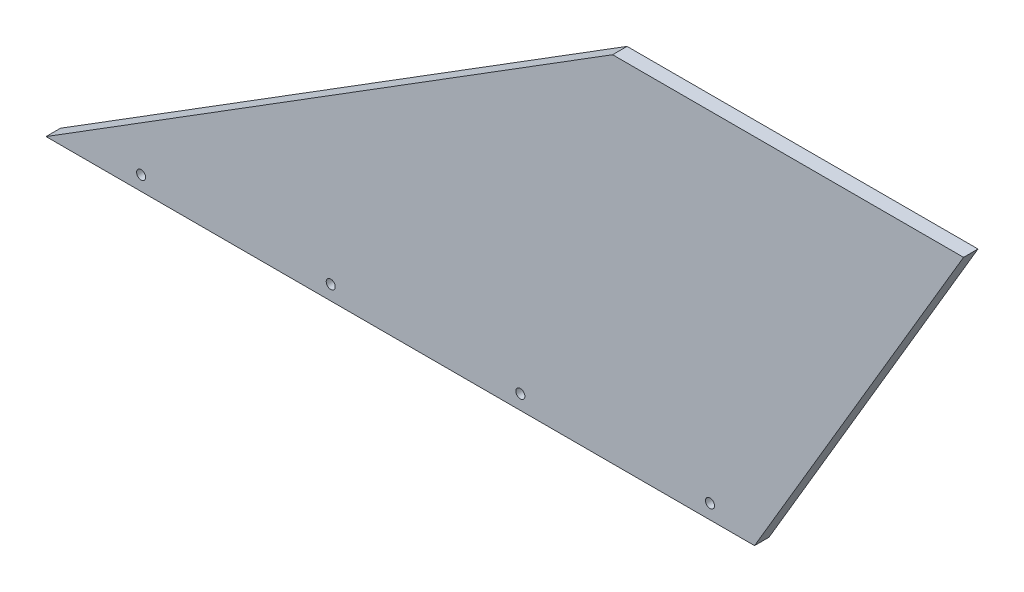
ISO-10303-21;
HEADER;
FILE_DESCRIPTION(('STEP AP214'),'2;1');
FILE_NAME('part.step','',(''),(''),'','','');
FILE_SCHEMA(('AUTOMOTIVE_DESIGN { 1 0 10303 214 1 1 1 1 }'));
ENDSEC;
DATA;
#1=APPLICATION_CONTEXT('core data for automotive mechanical design processes');
#2=APPLICATION_PROTOCOL_DEFINITION('international standard','automotive_design',2000,#1);
#3=PRODUCT_CONTEXT('',#1,'mechanical');
#4=PRODUCT('Part','Part','',(#3));
#5=PRODUCT_RELATED_PRODUCT_CATEGORY('part','',(#4));
#6=PRODUCT_DEFINITION_FORMATION('','',#4);
#7=PRODUCT_DEFINITION_CONTEXT('part definition',#1,'design');
#8=PRODUCT_DEFINITION('design','',#6,#7);
#9=PRODUCT_DEFINITION_SHAPE('','',#8);
#10=(LENGTH_UNIT() NAMED_UNIT(*) SI_UNIT(.MILLI.,.METRE.));
#11=(NAMED_UNIT(*) PLANE_ANGLE_UNIT() SI_UNIT($,.RADIAN.));
#12=(NAMED_UNIT(*) SI_UNIT($,.STERADIAN.) SOLID_ANGLE_UNIT());
#13=UNCERTAINTY_MEASURE_WITH_UNIT(LENGTH_MEASURE(1.E-05),#10,'distance_accuracy_value','');
#14=(GEOMETRIC_REPRESENTATION_CONTEXT(3) GLOBAL_UNCERTAINTY_ASSIGNED_CONTEXT((#13)) GLOBAL_UNIT_ASSIGNED_CONTEXT((#10,
#11,#12)) REPRESENTATION_CONTEXT('',''));
#15=CARTESIAN_POINT('',(0.,0.,0.));
#16=DIRECTION('',(0.,0.,1.));
#17=DIRECTION('',(1.,0.,0.));
#18=AXIS2_PLACEMENT_3D('',#15,#16,#17);
#19=CARTESIAN_POINT('',(0.,0.,3.048));
#20=DIRECTION('',(0.,0.,-1.));
#21=DIRECTION('',(-1.,0.,0.));
#22=AXIS2_PLACEMENT_3D('',#19,#20,#21);
#23=PLANE('',#22);
#24=CARTESIAN_POINT('',(-98.806,6.096,3.048));
#25=DIRECTION('',(0.,0.,1.));
#26=DIRECTION('',(1.,0.,0.));
#27=AXIS2_PLACEMENT_3D('',#24,#25,#26);
#28=CIRCLE('',#27,1.90500000000002);
#29=CARTESIAN_POINT('',(-96.901,6.096,3.048));
#30=VERTEX_POINT('',#29);
#31=EDGE_CURVE('E120',#30,#30,#28,.T.);
#32=ORIENTED_EDGE('',*,*,#31,.F.);
#33=EDGE_LOOP('',(#32));
#34=FACE_BOUND('',#33,.T.);
#35=CARTESIAN_POINT('',(-178.816,6.096,3.048));
#36=DIRECTION('',(0.,0.,1.));
#37=DIRECTION('',(1.,0.,0.));
#38=AXIS2_PLACEMENT_3D('',#35,#36,#37);
#39=CIRCLE('',#38,1.90500000000002);
#40=CARTESIAN_POINT('',(-176.911,6.096,3.048));
#41=VERTEX_POINT('',#40);
#42=EDGE_CURVE('E119',#41,#41,#39,.T.);
#43=ORIENTED_EDGE('',*,*,#42,.F.);
#44=EDGE_LOOP('',(#43));
#45=FACE_BOUND('',#44,.T.);
#46=CARTESIAN_POINT('',(-258.826,6.096,3.048));
#47=DIRECTION('',(0.,0.,1.));
#48=DIRECTION('',(1.,0.,0.));
#49=AXIS2_PLACEMENT_3D('',#46,#47,#48);
#50=CIRCLE('',#49,1.90499999999999);
#51=CARTESIAN_POINT('',(-256.921,6.096,3.048));
#52=VERTEX_POINT('',#51);
#53=EDGE_CURVE('E116',#52,#52,#50,.T.);
#54=ORIENTED_EDGE('',*,*,#53,.F.);
#55=EDGE_LOOP('',(#54));
#56=FACE_BOUND('',#55,.T.);
#57=DIRECTION('',(-1.,0.,0.));
#58=VECTOR('',#57,1.);
#59=CARTESIAN_POINT('',(-59.885399579228,149.447165674194,3.048));
#60=LINE('',#59,#58);
#61=CARTESIAN_POINT('',(88.196600420772,149.447165674194,3.048));
#62=VERTEX_POINT('',#61);
#63=CARTESIAN_POINT('',(-59.885399579228,149.447165674194,3.048));
#64=VERTEX_POINT('',#63);
#65=EDGE_CURVE('E93',#62,#64,#60,.T.);
#66=ORIENTED_EDGE('',*,*,#65,.T.);
#67=DIRECTION('',(-0.847955594881081,-0.530067268476249,0.));
#68=VECTOR('',#67,1.);
#69=CARTESIAN_POINT('',(-59.885399579228,149.447165674194,3.048));
#70=LINE('',#69,#68);
#71=CARTESIAN_POINT('',(-298.958,0.,3.048));
#72=VERTEX_POINT('',#71);
#73=EDGE_CURVE('E88',#64,#72,#70,.T.);
#74=ORIENTED_EDGE('',*,*,#73,.T.);
#75=DIRECTION('',(1.,0.,0.));
#76=VECTOR('',#75,1.);
#77=CARTESIAN_POINT('',(-298.958,0.,3.048));
#78=LINE('',#77,#76);
#79=CARTESIAN_POINT('',(0.,0.,3.048));
#80=VERTEX_POINT('',#79);
#81=EDGE_CURVE('E91',#72,#80,#78,.T.);
#82=ORIENTED_EDGE('',*,*,#81,.T.);
#83=DIRECTION('',(0.50824620385584,0.861211818466356,0.));
#84=VECTOR('',#83,1.);
#85=CARTESIAN_POINT('',(88.196600420772,149.447165674194,3.048));
#86=LINE('',#85,#84);
#87=EDGE_CURVE('E58',#80,#62,#86,.T.);
#88=ORIENTED_EDGE('',*,*,#87,.T.);
#89=EDGE_LOOP('',(#66,#74,#82,#88));
#90=FACE_BOUND('',#89,.T.);
#91=CARTESIAN_POINT('',(-18.796,6.096,3.048));
#92=DIRECTION('',(0.,0.,1.));
#93=DIRECTION('',(1.,0.,0.));
#94=AXIS2_PLACEMENT_3D('',#91,#92,#93);
#95=CIRCLE('',#94,1.90500000000001);
#96=CARTESIAN_POINT('',(-16.891,6.096,3.048));
#97=VERTEX_POINT('',#96);
#98=EDGE_CURVE('E131',#97,#97,#95,.T.);
#99=ORIENTED_EDGE('',*,*,#98,.F.);
#100=EDGE_LOOP('',(#99));
#101=FACE_BOUND('',#100,.T.);
#102=ADVANCED_FACE('F39',(#34,#45,#56,#90,#101),#23,.F.);
#103=CARTESIAN_POINT('',(-59.885399579228,149.447165674194,3.048));
#104=DIRECTION('',(0.,-1.,0.));
#105=DIRECTION('',(0.,0.,-1.));
#106=AXIS2_PLACEMENT_3D('',#103,#104,#105);
#107=PLANE('',#106);
#108=DIRECTION('',(-1.,0.,0.));
#109=VECTOR('',#108,1.);
#110=CARTESIAN_POINT('',(-59.885399579228,149.447165674194,-3.048));
#111=LINE('',#110,#109);
#112=CARTESIAN_POINT('',(88.196600420772,149.447165674194,-3.048));
#113=VERTEX_POINT('',#112);
#114=CARTESIAN_POINT('',(-59.885399579228,149.447165674194,-3.048));
#115=VERTEX_POINT('',#114);
#116=EDGE_CURVE('E106',#113,#115,#111,.T.);
#117=ORIENTED_EDGE('',*,*,#116,.T.);
#118=DIRECTION('',(0.,0.,-1.));
#119=VECTOR('',#118,1.);
#120=CARTESIAN_POINT('',(-59.885399579228,149.447165674194,3.048));
#121=LINE('',#120,#119);
#122=EDGE_CURVE('E11',#64,#115,#121,.T.);
#123=ORIENTED_EDGE('',*,*,#122,.F.);
#124=ORIENTED_EDGE('',*,*,#65,.F.);
#125=DIRECTION('',(0.,0.,-1.));
#126=VECTOR('',#125,1.);
#127=CARTESIAN_POINT('',(88.196600420772,149.447165674194,3.048));
#128=LINE('',#127,#126);
#129=EDGE_CURVE('E102',#62,#113,#128,.T.);
#130=ORIENTED_EDGE('',*,*,#129,.T.);
#131=EDGE_LOOP('',(#117,#123,#124,#130));
#132=FACE_BOUND('',#131,.T.);
#133=ADVANCED_FACE('F41',(#132),#107,.F.);
#134=CARTESIAN_POINT('',(-59.885399579228,149.447165674194,3.048));
#135=DIRECTION('',(0.530067268476249,-0.847955594881081,0.));
#136=DIRECTION('',(0.847955594881081,0.530067268476249,0.));
#137=AXIS2_PLACEMENT_3D('',#134,#135,#136);
#138=PLANE('',#137);
#139=DIRECTION('',(-0.847955594881081,-0.530067268476249,0.));
#140=VECTOR('',#139,1.);
#141=CARTESIAN_POINT('',(-59.885399579228,149.447165674194,-3.048));
#142=LINE('',#141,#140);
#143=CARTESIAN_POINT('',(-298.958,0.,-3.048));
#144=VERTEX_POINT('',#143);
#145=EDGE_CURVE('E97',#115,#144,#142,.T.);
#146=ORIENTED_EDGE('',*,*,#145,.T.);
#147=DIRECTION('',(0.,0.,-1.));
#148=VECTOR('',#147,1.);
#149=CARTESIAN_POINT('',(-298.958,0.,3.048));
#150=LINE('',#149,#148);
#151=EDGE_CURVE('E49',#72,#144,#150,.T.);
#152=ORIENTED_EDGE('',*,*,#151,.F.);
#153=ORIENTED_EDGE('',*,*,#73,.F.);
#154=ORIENTED_EDGE('',*,*,#122,.T.);
#155=EDGE_LOOP('',(#146,#152,#153,#154));
#156=FACE_BOUND('',#155,.T.);
#157=ADVANCED_FACE('F96',(#156),#138,.F.);
#158=CARTESIAN_POINT('',(-298.958,0.,3.048));
#159=DIRECTION('',(0.,1.,0.));
#160=DIRECTION('',(0.,0.,1.));
#161=AXIS2_PLACEMENT_3D('',#158,#159,#160);
#162=PLANE('',#161);
#163=DIRECTION('',(1.,0.,0.));
#164=VECTOR('',#163,1.);
#165=CARTESIAN_POINT('',(-298.958,0.,-3.048));
#166=LINE('',#165,#164);
#167=CARTESIAN_POINT('',(0.,0.,-3.048));
#168=VERTEX_POINT('',#167);
#169=EDGE_CURVE('E75',#144,#168,#166,.T.);
#170=ORIENTED_EDGE('',*,*,#169,.T.);
#171=DIRECTION('',(0.,0.,-1.));
#172=VECTOR('',#171,1.);
#173=CARTESIAN_POINT('',(0.,0.,3.048));
#174=LINE('',#173,#172);
#175=EDGE_CURVE('E98',#80,#168,#174,.T.);
#176=ORIENTED_EDGE('',*,*,#175,.F.);
#177=ORIENTED_EDGE('',*,*,#81,.F.);
#178=ORIENTED_EDGE('',*,*,#151,.T.);
#179=EDGE_LOOP('',(#170,#176,#177,#178));
#180=FACE_BOUND('',#179,.T.);
#181=ADVANCED_FACE('F100',(#180),#162,.F.);
#182=CARTESIAN_POINT('',(88.196600420772,149.447165674194,3.048));
#183=DIRECTION('',(-0.861211818466356,0.50824620385584,0.));
#184=DIRECTION('',(-0.50824620385584,-0.861211818466356,0.));
#185=AXIS2_PLACEMENT_3D('',#182,#183,#184);
#186=PLANE('',#185);
#187=DIRECTION('',(0.50824620385584,0.861211818466356,0.));
#188=VECTOR('',#187,1.);
#189=CARTESIAN_POINT('',(88.196600420772,149.447165674194,-3.048));
#190=LINE('',#189,#188);
#191=EDGE_CURVE('E81',#168,#113,#190,.T.);
#192=ORIENTED_EDGE('',*,*,#191,.T.);
#193=ORIENTED_EDGE('',*,*,#129,.F.);
#194=ORIENTED_EDGE('',*,*,#87,.F.);
#195=ORIENTED_EDGE('',*,*,#175,.T.);
#196=EDGE_LOOP('',(#192,#193,#194,#195));
#197=FACE_BOUND('',#196,.T.);
#198=ADVANCED_FACE('F156',(#197),#186,.F.);
#199=CARTESIAN_POINT('',(0.,0.,-3.048));
#200=DIRECTION('',(0.,0.,-1.));
#201=DIRECTION('',(-1.,0.,0.));
#202=AXIS2_PLACEMENT_3D('',#199,#200,#201);
#203=PLANE('',#202);
#204=CARTESIAN_POINT('',(-18.796,6.096,-3.048));
#205=DIRECTION('',(0.,0.,-1.));
#206=DIRECTION('',(-1.,0.,0.));
#207=AXIS2_PLACEMENT_3D('',#204,#205,#206);
#208=CIRCLE('',#207,1.90500000000001);
#209=CARTESIAN_POINT('',(-20.701,6.096,-3.048));
#210=VERTEX_POINT('',#209);
#211=EDGE_CURVE('E43',#210,#210,#208,.T.);
#212=ORIENTED_EDGE('',*,*,#211,.F.);
#213=EDGE_LOOP('',(#212));
#214=FACE_BOUND('',#213,.T.);
#215=CARTESIAN_POINT('',(-98.806,6.096,-3.048));
#216=DIRECTION('',(0.,0.,-1.));
#217=DIRECTION('',(-1.,0.,0.));
#218=AXIS2_PLACEMENT_3D('',#215,#216,#217);
#219=CIRCLE('',#218,1.90500000000002);
#220=CARTESIAN_POINT('',(-100.711,6.096,-3.048));
#221=VERTEX_POINT('',#220);
#222=EDGE_CURVE('E117',#221,#221,#219,.T.);
#223=ORIENTED_EDGE('',*,*,#222,.F.);
#224=EDGE_LOOP('',(#223));
#225=FACE_BOUND('',#224,.T.);
#226=CARTESIAN_POINT('',(-178.816,6.096,-3.048));
#227=DIRECTION('',(0.,0.,-1.));
#228=DIRECTION('',(-1.,0.,0.));
#229=AXIS2_PLACEMENT_3D('',#226,#227,#228);
#230=CIRCLE('',#229,1.90500000000002);
#231=CARTESIAN_POINT('',(-180.721,6.096,-3.048));
#232=VERTEX_POINT('',#231);
#233=EDGE_CURVE('E124',#232,#232,#230,.T.);
#234=ORIENTED_EDGE('',*,*,#233,.F.);
#235=EDGE_LOOP('',(#234));
#236=FACE_BOUND('',#235,.T.);
#237=CARTESIAN_POINT('',(-258.826,6.096,-3.048));
#238=DIRECTION('',(0.,0.,-1.));
#239=DIRECTION('',(-1.,0.,0.));
#240=AXIS2_PLACEMENT_3D('',#237,#238,#239);
#241=CIRCLE('',#240,1.90499999999999);
#242=CARTESIAN_POINT('',(-260.731,6.096,-3.048));
#243=VERTEX_POINT('',#242);
#244=EDGE_CURVE('E109',#243,#243,#241,.T.);
#245=ORIENTED_EDGE('',*,*,#244,.F.);
#246=EDGE_LOOP('',(#245));
#247=FACE_BOUND('',#246,.T.);
#248=ORIENTED_EDGE('',*,*,#116,.F.);
#249=ORIENTED_EDGE('',*,*,#191,.F.);
#250=ORIENTED_EDGE('',*,*,#169,.F.);
#251=ORIENTED_EDGE('',*,*,#145,.F.);
#252=EDGE_LOOP('',(#248,#249,#250,#251));
#253=FACE_BOUND('',#252,.T.);
#254=ADVANCED_FACE('F154',(#214,#225,#236,#247,#253),#203,.T.);
#255=CARTESIAN_POINT('',(-258.826,6.096,3.048));
#256=DIRECTION('',(0.,0.,1.));
#257=DIRECTION('',(1.,0.,0.));
#258=AXIS2_PLACEMENT_3D('',#255,#256,#257);
#259=CYLINDRICAL_SURFACE('',#258,1.90499999999999);
#260=ORIENTED_EDGE('',*,*,#244,.T.);
#261=EDGE_LOOP('',(#260));
#262=FACE_BOUND('',#261,.T.);
#263=ORIENTED_EDGE('',*,*,#53,.T.);
#264=EDGE_LOOP('',(#263));
#265=FACE_BOUND('',#264,.T.);
#266=ADVANCED_FACE('F139',(#262,#265),#259,.F.);
#267=CARTESIAN_POINT('',(-178.816,6.096,3.048));
#268=DIRECTION('',(0.,0.,1.));
#269=DIRECTION('',(1.,0.,0.));
#270=AXIS2_PLACEMENT_3D('',#267,#268,#269);
#271=CYLINDRICAL_SURFACE('',#270,1.90500000000002);
#272=ORIENTED_EDGE('',*,*,#233,.T.);
#273=EDGE_LOOP('',(#272));
#274=FACE_BOUND('',#273,.T.);
#275=ORIENTED_EDGE('',*,*,#42,.T.);
#276=EDGE_LOOP('',(#275));
#277=FACE_BOUND('',#276,.T.);
#278=ADVANCED_FACE('F182',(#274,#277),#271,.F.);
#279=CARTESIAN_POINT('',(-98.806,6.096,3.048));
#280=DIRECTION('',(0.,0.,1.));
#281=DIRECTION('',(1.,0.,0.));
#282=AXIS2_PLACEMENT_3D('',#279,#280,#281);
#283=CYLINDRICAL_SURFACE('',#282,1.90500000000002);
#284=ORIENTED_EDGE('',*,*,#222,.T.);
#285=EDGE_LOOP('',(#284));
#286=FACE_BOUND('',#285,.T.);
#287=ORIENTED_EDGE('',*,*,#31,.T.);
#288=EDGE_LOOP('',(#287));
#289=FACE_BOUND('',#288,.T.);
#290=ADVANCED_FACE('F201',(#286,#289),#283,.F.);
#291=CARTESIAN_POINT('',(-18.796,6.096,3.048));
#292=DIRECTION('',(0.,0.,1.));
#293=DIRECTION('',(1.,0.,0.));
#294=AXIS2_PLACEMENT_3D('',#291,#292,#293);
#295=CYLINDRICAL_SURFACE('',#294,1.90500000000001);
#296=ORIENTED_EDGE('',*,*,#211,.T.);
#297=EDGE_LOOP('',(#296));
#298=FACE_BOUND('',#297,.T.);
#299=ORIENTED_EDGE('',*,*,#98,.T.);
#300=EDGE_LOOP('',(#299));
#301=FACE_BOUND('',#300,.T.);
#302=ADVANCED_FACE('F210',(#298,#301),#295,.F.);
#303=CLOSED_SHELL('',(#102,#133,#157,#181,#198,#254,#266,#278,#290,#302));
#304=MANIFOLD_SOLID_BREP('B2',#303);
#305=ADVANCED_BREP_SHAPE_REPRESENTATION('',(#18,#304),#14);
#306=SHAPE_DEFINITION_REPRESENTATION(#9,#305);
ENDSEC;
END-ISO-10303-21;
